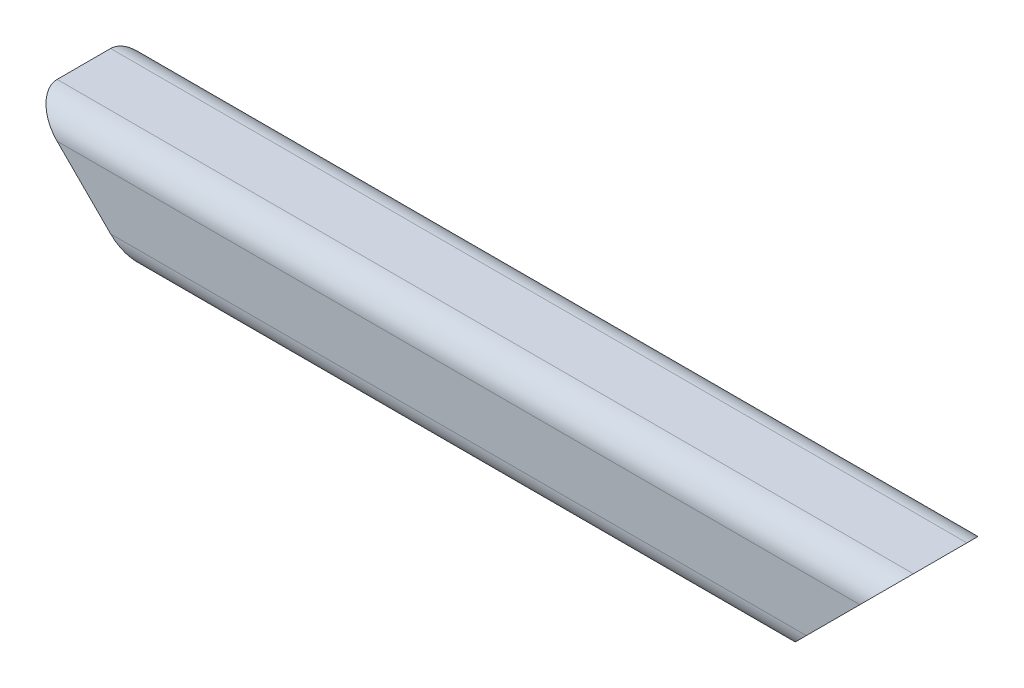
ISO-10303-21;
HEADER;
FILE_DESCRIPTION(('STEP AP214'),'2;1');
FILE_NAME('part.step','',(''),(''),'','','');
FILE_SCHEMA(('AUTOMOTIVE_DESIGN { 1 0 10303 214 1 1 1 1 }'));
ENDSEC;
DATA;
#1=APPLICATION_CONTEXT('core data for automotive mechanical design processes');
#2=APPLICATION_PROTOCOL_DEFINITION('international standard','automotive_design',2000,#1);
#3=PRODUCT_CONTEXT('',#1,'mechanical');
#4=PRODUCT('Part','Part','',(#3));
#5=PRODUCT_RELATED_PRODUCT_CATEGORY('part','',(#4));
#6=PRODUCT_DEFINITION_FORMATION('','',#4);
#7=PRODUCT_DEFINITION_CONTEXT('part definition',#1,'design');
#8=PRODUCT_DEFINITION('design','',#6,#7);
#9=PRODUCT_DEFINITION_SHAPE('','',#8);
#10=(LENGTH_UNIT() NAMED_UNIT(*) SI_UNIT(.MILLI.,.METRE.));
#11=(NAMED_UNIT(*) PLANE_ANGLE_UNIT() SI_UNIT($,.RADIAN.));
#12=(NAMED_UNIT(*) SI_UNIT($,.STERADIAN.) SOLID_ANGLE_UNIT());
#13=UNCERTAINTY_MEASURE_WITH_UNIT(LENGTH_MEASURE(1.E-05),#10,'distance_accuracy_value','');
#14=(GEOMETRIC_REPRESENTATION_CONTEXT(3) GLOBAL_UNCERTAINTY_ASSIGNED_CONTEXT((#13)) GLOBAL_UNIT_ASSIGNED_CONTEXT((#10,
#11,#12)) REPRESENTATION_CONTEXT('',''));
#15=CARTESIAN_POINT('',(0.,0.,0.));
#16=DIRECTION('',(0.,0.,1.));
#17=DIRECTION('',(1.,0.,0.));
#18=AXIS2_PLACEMENT_3D('',#15,#16,#17);
#19=CARTESIAN_POINT('',(-406.4,12.7,12.7));
#20=DIRECTION('',(1.,0.,0.));
#21=DIRECTION('',(0.,0.,-1.));
#22=AXIS2_PLACEMENT_3D('',#19,#20,#21);
#23=CYLINDRICAL_SURFACE('',#22,12.7);
#24=DIRECTION('',(1.,0.,0.));
#25=VECTOR('',#24,1.);
#26=CARTESIAN_POINT('',(-406.4,12.7,25.4));
#27=LINE('',#26,#25);
#28=CARTESIAN_POINT('',(-393.7,12.7,25.4));
#29=VERTEX_POINT('',#28);
#30=CARTESIAN_POINT('',(-12.7,12.7,25.4));
#31=VERTEX_POINT('',#30);
#32=EDGE_CURVE('E193',#29,#31,#27,.T.);
#33=ORIENTED_EDGE('',*,*,#32,.T.);
#34=CARTESIAN_POINT('',(-12.7,12.7,12.7));
#35=DIRECTION('',(-0.707106781186548,0.707106781186548,0.));
#36=DIRECTION('',(0.707106781186548,0.707106781186548,0.));
#37=AXIS2_PLACEMENT_3D('',#34,#35,#36);
#38=ELLIPSE('',#37,17.9605122421383,12.7);
#39=CARTESIAN_POINT('',(0.,25.4,12.7));
#40=VERTEX_POINT('',#39);
#41=EDGE_CURVE('E175',#31,#40,#38,.T.);
#42=ORIENTED_EDGE('',*,*,#41,.T.);
#43=DIRECTION('',(1.,0.,0.));
#44=VECTOR('',#43,1.);
#45=CARTESIAN_POINT('',(-406.4,25.4,12.7));
#46=LINE('',#45,#44);
#47=CARTESIAN_POINT('',(-406.4,25.4,12.7));
#48=VERTEX_POINT('',#47);
#49=EDGE_CURVE('E12',#48,#40,#46,.T.);
#50=ORIENTED_EDGE('',*,*,#49,.F.);
#51=CARTESIAN_POINT('',(-393.7,12.7,12.7));
#52=DIRECTION('',(0.707106781186547,0.707106781186548,0.));
#53=DIRECTION('',(0.707106781186548,-0.707106781186547,0.));
#54=AXIS2_PLACEMENT_3D('',#51,#52,#53);
#55=ELLIPSE('',#54,17.9605122421383,12.7);
#56=EDGE_CURVE('E199',#48,#29,#55,.T.);
#57=ORIENTED_EDGE('',*,*,#56,.T.);
#58=EDGE_LOOP('',(#33,#42,#50,#57));
#59=FACE_BOUND('',#58,.T.);
#60=ADVANCED_FACE('F61',(#59),#23,.T.);
#61=CARTESIAN_POINT('',(-406.4,25.4,12.7));
#62=DIRECTION('',(0.,-1.,0.));
#63=DIRECTION('',(0.,0.,-1.));
#64=AXIS2_PLACEMENT_3D('',#61,#62,#63);
#65=PLANE('',#64);
#66=DIRECTION('',(0.,0.,-1.));
#67=VECTOR('',#66,1.);
#68=CARTESIAN_POINT('',(0.,25.4,12.7));
#69=LINE('',#68,#67);
#70=CARTESIAN_POINT('',(0.,25.4,-12.7));
#71=VERTEX_POINT('',#70);
#72=EDGE_CURVE('E181',#40,#71,#69,.T.);
#73=ORIENTED_EDGE('',*,*,#72,.T.);
#74=DIRECTION('',(1.,0.,0.));
#75=VECTOR('',#74,1.);
#76=CARTESIAN_POINT('',(-406.4,25.4,-12.7));
#77=LINE('',#76,#75);
#78=CARTESIAN_POINT('',(-406.4,25.4,-12.7));
#79=VERTEX_POINT('',#78);
#80=EDGE_CURVE('E70',#79,#71,#77,.T.);
#81=ORIENTED_EDGE('',*,*,#80,.F.);
#82=DIRECTION('',(0.,0.,-1.));
#83=VECTOR('',#82,1.);
#84=CARTESIAN_POINT('',(-406.4,25.4,12.7));
#85=LINE('',#84,#83);
#86=EDGE_CURVE('E225',#48,#79,#85,.T.);
#87=ORIENTED_EDGE('',*,*,#86,.F.);
#88=ORIENTED_EDGE('',*,*,#49,.T.);
#89=EDGE_LOOP('',(#73,#81,#87,#88));
#90=FACE_BOUND('',#89,.T.);
#91=ADVANCED_FACE('F300',(#90),#65,.F.);
#92=CARTESIAN_POINT('',(-406.4,12.7,-12.7));
#93=DIRECTION('',(1.,0.,0.));
#94=DIRECTION('',(0.,0.,-1.));
#95=AXIS2_PLACEMENT_3D('',#92,#93,#94);
#96=CYLINDRICAL_SURFACE('',#95,12.7);
#97=ORIENTED_EDGE('',*,*,#80,.T.);
#98=CARTESIAN_POINT('',(-12.7,12.7,-12.7));
#99=DIRECTION('',(-0.707106781186548,0.707106781186548,0.));
#100=DIRECTION('',(0.707106781186548,0.707106781186548,0.));
#101=AXIS2_PLACEMENT_3D('',#98,#99,#100);
#102=ELLIPSE('',#101,17.9605122421383,12.7);
#103=CARTESIAN_POINT('',(-12.7,12.7,-25.4));
#104=VERTEX_POINT('',#103);
#105=EDGE_CURVE('E186',#71,#104,#102,.T.);
#106=ORIENTED_EDGE('',*,*,#105,.T.);
#107=DIRECTION('',(1.,0.,0.));
#108=VECTOR('',#107,1.);
#109=CARTESIAN_POINT('',(-406.4,12.7,-25.4));
#110=LINE('',#109,#108);
#111=CARTESIAN_POINT('',(-393.7,12.7,-25.4));
#112=VERTEX_POINT('',#111);
#113=EDGE_CURVE('E216',#112,#104,#110,.T.);
#114=ORIENTED_EDGE('',*,*,#113,.F.);
#115=CARTESIAN_POINT('',(-393.7,12.7,-12.7));
#116=DIRECTION('',(0.707106781186547,0.707106781186548,0.));
#117=DIRECTION('',(0.707106781186548,-0.707106781186547,0.));
#118=AXIS2_PLACEMENT_3D('',#115,#116,#117);
#119=ELLIPSE('',#118,17.9605122421383,12.7);
#120=EDGE_CURVE('E293',#112,#79,#119,.T.);
#121=ORIENTED_EDGE('',*,*,#120,.T.);
#122=EDGE_LOOP('',(#97,#106,#114,#121));
#123=FACE_BOUND('',#122,.T.);
#124=ADVANCED_FACE('F302',(#123),#96,.T.);
#125=CARTESIAN_POINT('',(-406.4,-12.7,-25.4));
#126=DIRECTION('',(0.,0.,1.));
#127=DIRECTION('',(1.,0.,0.));
#128=AXIS2_PLACEMENT_3D('',#125,#126,#127);
#129=PLANE('',#128);
#130=ORIENTED_EDGE('',*,*,#113,.T.);
#131=DIRECTION('',(-0.707106781186547,-0.707106781186547,0.));
#132=VECTOR('',#131,1.);
#133=CARTESIAN_POINT('',(0.,25.4,-25.4));
#134=LINE('',#133,#132);
#135=CARTESIAN_POINT('',(-38.1,-12.7,-25.4));
#136=VERTEX_POINT('',#135);
#137=EDGE_CURVE('E196',#104,#136,#134,.T.);
#138=ORIENTED_EDGE('',*,*,#137,.T.);
#139=DIRECTION('',(1.,0.,0.));
#140=VECTOR('',#139,1.);
#141=CARTESIAN_POINT('',(-406.4,-12.7,-25.4));
#142=LINE('',#141,#140);
#143=CARTESIAN_POINT('',(-368.3,-12.7,-25.4));
#144=VERTEX_POINT('',#143);
#145=EDGE_CURVE('E213',#144,#136,#142,.T.);
#146=ORIENTED_EDGE('',*,*,#145,.F.);
#147=DIRECTION('',(-0.707106781186548,0.707106781186547,0.));
#148=VECTOR('',#147,1.);
#149=CARTESIAN_POINT('',(-406.4,25.4,-25.4));
#150=LINE('',#149,#148);
#151=EDGE_CURVE('E268',#144,#112,#150,.T.);
#152=ORIENTED_EDGE('',*,*,#151,.T.);
#153=EDGE_LOOP('',(#130,#138,#146,#152));
#154=FACE_BOUND('',#153,.T.);
#155=ADVANCED_FACE('F307',(#154),#129,.F.);
#156=CARTESIAN_POINT('',(-406.4,-12.7,-12.7));
#157=DIRECTION('',(1.,0.,0.));
#158=DIRECTION('',(0.,0.,-1.));
#159=AXIS2_PLACEMENT_3D('',#156,#157,#158);
#160=CYLINDRICAL_SURFACE('',#159,12.7);
#161=ORIENTED_EDGE('',*,*,#145,.T.);
#162=CARTESIAN_POINT('',(-38.1,-12.7,-12.7));
#163=DIRECTION('',(-0.707106781186548,0.707106781186548,0.));
#164=DIRECTION('',(0.707106781186548,0.707106781186548,0.));
#165=AXIS2_PLACEMENT_3D('',#162,#163,#164);
#166=ELLIPSE('',#165,17.9605122421383,12.7);
#167=CARTESIAN_POINT('',(-50.8,-25.4,-12.7));
#168=VERTEX_POINT('',#167);
#169=EDGE_CURVE('E263',#136,#168,#166,.T.);
#170=ORIENTED_EDGE('',*,*,#169,.T.);
#171=DIRECTION('',(1.,0.,0.));
#172=VECTOR('',#171,1.);
#173=CARTESIAN_POINT('',(-406.4,-25.4,-12.7));
#174=LINE('',#173,#172);
#175=CARTESIAN_POINT('',(-355.6,-25.4,-12.7));
#176=VERTEX_POINT('',#175);
#177=EDGE_CURVE('E210',#176,#168,#174,.T.);
#178=ORIENTED_EDGE('',*,*,#177,.F.);
#179=CARTESIAN_POINT('',(-368.3,-12.7,-12.7));
#180=DIRECTION('',(0.707106781186547,0.707106781186548,0.));
#181=DIRECTION('',(0.707106781186548,-0.707106781186547,0.));
#182=AXIS2_PLACEMENT_3D('',#179,#180,#181);
#183=ELLIPSE('',#182,17.9605122421383,12.7);
#184=EDGE_CURVE('E290',#176,#144,#183,.T.);
#185=ORIENTED_EDGE('',*,*,#184,.T.);
#186=EDGE_LOOP('',(#161,#170,#178,#185));
#187=FACE_BOUND('',#186,.T.);
#188=ADVANCED_FACE('F310',(#187),#160,.T.);
#189=CARTESIAN_POINT('',(-406.4,-25.4,-12.7));
#190=DIRECTION('',(0.,1.,0.));
#191=DIRECTION('',(0.,0.,1.));
#192=AXIS2_PLACEMENT_3D('',#189,#190,#191);
#193=PLANE('',#192);
#194=ORIENTED_EDGE('',*,*,#177,.T.);
#195=DIRECTION('',(0.,0.,1.));
#196=VECTOR('',#195,1.);
#197=CARTESIAN_POINT('',(-50.8,-25.4,-25.4));
#198=LINE('',#197,#196);
#199=CARTESIAN_POINT('',(-50.8,-25.4,12.7));
#200=VERTEX_POINT('',#199);
#201=EDGE_CURVE('E317',#168,#200,#198,.T.);
#202=ORIENTED_EDGE('',*,*,#201,.T.);
#203=DIRECTION('',(1.,0.,0.));
#204=VECTOR('',#203,1.);
#205=CARTESIAN_POINT('',(-406.4,-25.4,12.7));
#206=LINE('',#205,#204);
#207=CARTESIAN_POINT('',(-355.6,-25.4,12.7));
#208=VERTEX_POINT('',#207);
#209=EDGE_CURVE('E201',#208,#200,#206,.T.);
#210=ORIENTED_EDGE('',*,*,#209,.F.);
#211=DIRECTION('',(0.,0.,1.));
#212=VECTOR('',#211,1.);
#213=CARTESIAN_POINT('',(-355.6,-25.4,-25.4));
#214=LINE('',#213,#212);
#215=EDGE_CURVE('E271',#176,#208,#214,.T.);
#216=ORIENTED_EDGE('',*,*,#215,.F.);
#217=EDGE_LOOP('',(#194,#202,#210,#216));
#218=FACE_BOUND('',#217,.T.);
#219=ADVANCED_FACE('F315',(#218),#193,.F.);
#220=CARTESIAN_POINT('',(-406.4,-12.7,12.7));
#221=DIRECTION('',(1.,0.,0.));
#222=DIRECTION('',(0.,0.,-1.));
#223=AXIS2_PLACEMENT_3D('',#220,#221,#222);
#224=CYLINDRICAL_SURFACE('',#223,12.7);
#225=ORIENTED_EDGE('',*,*,#209,.T.);
#226=CARTESIAN_POINT('',(-38.1,-12.7,12.7));
#227=DIRECTION('',(-0.707106781186548,0.707106781186548,0.));
#228=DIRECTION('',(0.707106781186548,0.707106781186548,0.));
#229=AXIS2_PLACEMENT_3D('',#226,#227,#228);
#230=ELLIPSE('',#229,17.9605122421383,12.7);
#231=CARTESIAN_POINT('',(-38.1,-12.7,25.4));
#232=VERTEX_POINT('',#231);
#233=EDGE_CURVE('E256',#200,#232,#230,.T.);
#234=ORIENTED_EDGE('',*,*,#233,.T.);
#235=DIRECTION('',(1.,0.,0.));
#236=VECTOR('',#235,1.);
#237=CARTESIAN_POINT('',(-406.4,-12.7,25.4));
#238=LINE('',#237,#236);
#239=CARTESIAN_POINT('',(-368.3,-12.7,25.4));
#240=VERTEX_POINT('',#239);
#241=EDGE_CURVE('E195',#240,#232,#238,.T.);
#242=ORIENTED_EDGE('',*,*,#241,.F.);
#243=CARTESIAN_POINT('',(-368.3,-12.7,12.7));
#244=DIRECTION('',(0.707106781186547,0.707106781186548,0.));
#245=DIRECTION('',(0.707106781186548,-0.707106781186547,0.));
#246=AXIS2_PLACEMENT_3D('',#243,#244,#245);
#247=ELLIPSE('',#246,17.9605122421383,12.7);
#248=EDGE_CURVE('E287',#240,#208,#247,.T.);
#249=ORIENTED_EDGE('',*,*,#248,.T.);
#250=EDGE_LOOP('',(#225,#234,#242,#249));
#251=FACE_BOUND('',#250,.T.);
#252=ADVANCED_FACE('F319',(#251),#224,.T.);
#253=CARTESIAN_POINT('',(-406.4,12.7,-12.7));
#254=DIRECTION('',(1.,0.,0.));
#255=DIRECTION('',(0.,0.,-1.));
#256=AXIS2_PLACEMENT_3D('',#253,#254,#255);
#257=CYLINDRICAL_SURFACE('',#256,9.525);
#258=CARTESIAN_POINT('',(-12.7,12.7,-12.7));
#259=DIRECTION('',(-0.707106781186548,0.707106781186548,0.));
#260=DIRECTION('',(0.707106781186548,0.707106781186548,0.));
#261=AXIS2_PLACEMENT_3D('',#258,#259,#260);
#262=ELLIPSE('',#261,13.4703841816037,9.525);
#263=CARTESIAN_POINT('',(-3.17500000000004,22.225,-12.7));
#264=VERTEX_POINT('',#263);
#265=CARTESIAN_POINT('',(-12.7000000000001,12.7,-22.225));
#266=VERTEX_POINT('',#265);
#267=EDGE_CURVE('E78',#264,#266,#262,.T.);
#268=ORIENTED_EDGE('',*,*,#267,.F.);
#269=DIRECTION('',(1.,0.,0.));
#270=VECTOR('',#269,1.);
#271=CARTESIAN_POINT('',(-406.4,22.225,-12.7));
#272=LINE('',#271,#270);
#273=CARTESIAN_POINT('',(-403.225,22.225,-12.7));
#274=VERTEX_POINT('',#273);
#275=EDGE_CURVE('E65',#274,#264,#272,.T.);
#276=ORIENTED_EDGE('',*,*,#275,.F.);
#277=CARTESIAN_POINT('',(-393.7,12.7,-12.7));
#278=DIRECTION('',(0.707106781186547,0.707106781186548,0.));
#279=DIRECTION('',(0.707106781186548,-0.707106781186547,0.));
#280=AXIS2_PLACEMENT_3D('',#277,#278,#279);
#281=ELLIPSE('',#280,13.4703841816037,9.525);
#282=CARTESIAN_POINT('',(-393.7,12.7,-22.225));
#283=VERTEX_POINT('',#282);
#284=EDGE_CURVE('E285',#283,#274,#281,.T.);
#285=ORIENTED_EDGE('',*,*,#284,.F.);
#286=DIRECTION('',(1.,0.,0.));
#287=VECTOR('',#286,1.);
#288=CARTESIAN_POINT('',(-406.4,12.7,-22.225));
#289=LINE('',#288,#287);
#290=EDGE_CURVE('E221',#283,#266,#289,.T.);
#291=ORIENTED_EDGE('',*,*,#290,.T.);
#292=EDGE_LOOP('',(#268,#276,#285,#291));
#293=FACE_BOUND('',#292,.T.);
#294=ADVANCED_FACE('F63',(#293),#257,.F.);
#295=CARTESIAN_POINT('',(-406.4,22.225,12.7));
#296=DIRECTION('',(0.,-1.,0.));
#297=DIRECTION('',(0.,0.,-1.));
#298=AXIS2_PLACEMENT_3D('',#295,#296,#297);
#299=PLANE('',#298);
#300=DIRECTION('',(0.,0.,-1.));
#301=VECTOR('',#300,1.);
#302=CARTESIAN_POINT('',(-3.17500000000004,22.225,12.7));
#303=LINE('',#302,#301);
#304=CARTESIAN_POINT('',(-3.17500000000004,22.225,12.7));
#305=VERTEX_POINT('',#304);
#306=EDGE_CURVE('E254',#305,#264,#303,.T.);
#307=ORIENTED_EDGE('',*,*,#306,.F.);
#308=DIRECTION('',(1.,0.,0.));
#309=VECTOR('',#308,1.);
#310=CARTESIAN_POINT('',(-406.4,22.225,12.7));
#311=LINE('',#310,#309);
#312=CARTESIAN_POINT('',(-403.225,22.225,12.7));
#313=VERTEX_POINT('',#312);
#314=EDGE_CURVE('E204',#313,#305,#311,.T.);
#315=ORIENTED_EDGE('',*,*,#314,.F.);
#316=DIRECTION('',(0.,0.,1.));
#317=VECTOR('',#316,1.);
#318=CARTESIAN_POINT('',(-403.225,22.225,12.7));
#319=LINE('',#318,#317);
#320=EDGE_CURVE('E252',#274,#313,#319,.T.);
#321=ORIENTED_EDGE('',*,*,#320,.F.);
#322=ORIENTED_EDGE('',*,*,#275,.T.);
#323=EDGE_LOOP('',(#307,#315,#321,#322));
#324=FACE_BOUND('',#323,.T.);
#325=ADVANCED_FACE('F251',(#324),#299,.T.);
#326=CARTESIAN_POINT('',(-406.4,12.7,12.7));
#327=DIRECTION('',(1.,0.,0.));
#328=DIRECTION('',(0.,0.,-1.));
#329=AXIS2_PLACEMENT_3D('',#326,#327,#328);
#330=CYLINDRICAL_SURFACE('',#329,9.525);
#331=CARTESIAN_POINT('',(-12.7,12.7,12.7));
#332=DIRECTION('',(-0.707106781186548,0.707106781186548,0.));
#333=DIRECTION('',(0.707106781186548,0.707106781186548,0.));
#334=AXIS2_PLACEMENT_3D('',#331,#332,#333);
#335=ELLIPSE('',#334,13.4703841816037,9.525);
#336=CARTESIAN_POINT('',(-12.7,12.7,22.225));
#337=VERTEX_POINT('',#336);
#338=EDGE_CURVE('E246',#337,#305,#335,.T.);
#339=ORIENTED_EDGE('',*,*,#338,.F.);
#340=DIRECTION('',(1.,0.,0.));
#341=VECTOR('',#340,1.);
#342=CARTESIAN_POINT('',(-406.4,12.7,22.225));
#343=LINE('',#342,#341);
#344=CARTESIAN_POINT('',(-393.7,12.7,22.225));
#345=VERTEX_POINT('',#344);
#346=EDGE_CURVE('E237',#345,#337,#343,.T.);
#347=ORIENTED_EDGE('',*,*,#346,.F.);
#348=CARTESIAN_POINT('',(-393.7,12.7,12.7));
#349=DIRECTION('',(0.707106781186547,0.707106781186548,0.));
#350=DIRECTION('',(0.707106781186548,-0.707106781186547,0.));
#351=AXIS2_PLACEMENT_3D('',#348,#349,#350);
#352=ELLIPSE('',#351,13.4703841816037,9.525);
#353=EDGE_CURVE('E247',#313,#345,#352,.T.);
#354=ORIENTED_EDGE('',*,*,#353,.F.);
#355=ORIENTED_EDGE('',*,*,#314,.T.);
#356=EDGE_LOOP('',(#339,#347,#354,#355));
#357=FACE_BOUND('',#356,.T.);
#358=ADVANCED_FACE('F244',(#357),#330,.F.);
#359=CARTESIAN_POINT('',(-406.4,12.7,22.225));
#360=DIRECTION('',(0.,0.,-1.));
#361=DIRECTION('',(-1.,0.,0.));
#362=AXIS2_PLACEMENT_3D('',#359,#360,#361);
#363=PLANE('',#362);
#364=DIRECTION('',(0.707106781186548,0.707106781186548,0.));
#365=VECTOR('',#364,1.);
#366=CARTESIAN_POINT('',(-209.55,-184.15,22.225));
#367=LINE('',#366,#365);
#368=CARTESIAN_POINT('',(-38.1,-12.7,22.225));
#369=VERTEX_POINT('',#368);
#370=EDGE_CURVE('E258',#369,#337,#367,.T.);
#371=ORIENTED_EDGE('',*,*,#370,.F.);
#372=DIRECTION('',(1.,0.,0.));
#373=VECTOR('',#372,1.);
#374=CARTESIAN_POINT('',(-406.4,-12.7,22.225));
#375=LINE('',#374,#373);
#376=CARTESIAN_POINT('',(-368.3,-12.7,22.225));
#377=VERTEX_POINT('',#376);
#378=EDGE_CURVE('E234',#377,#369,#375,.T.);
#379=ORIENTED_EDGE('',*,*,#378,.F.);
#380=DIRECTION('',(0.707106781186548,-0.707106781186547,0.));
#381=VECTOR('',#380,1.);
#382=CARTESIAN_POINT('',(-400.05,19.05,22.225));
#383=LINE('',#382,#381);
#384=EDGE_CURVE('E281',#345,#377,#383,.T.);
#385=ORIENTED_EDGE('',*,*,#384,.F.);
#386=ORIENTED_EDGE('',*,*,#346,.T.);
#387=EDGE_LOOP('',(#371,#379,#385,#386));
#388=FACE_BOUND('',#387,.T.);
#389=ADVANCED_FACE('F334',(#388),#363,.T.);
#390=CARTESIAN_POINT('',(-406.4,-12.7,12.7));
#391=DIRECTION('',(1.,0.,0.));
#392=DIRECTION('',(0.,0.,-1.));
#393=AXIS2_PLACEMENT_3D('',#390,#391,#392);
#394=CYLINDRICAL_SURFACE('',#393,9.525);
#395=CARTESIAN_POINT('',(-38.1,-12.7,12.7));
#396=DIRECTION('',(-0.707106781186548,0.707106781186548,0.));
#397=DIRECTION('',(0.707106781186548,0.707106781186548,0.));
#398=AXIS2_PLACEMENT_3D('',#395,#396,#397);
#399=ELLIPSE('',#398,13.4703841816037,9.525);
#400=CARTESIAN_POINT('',(-47.625,-22.225,12.7));
#401=VERTEX_POINT('',#400);
#402=EDGE_CURVE('E329',#401,#369,#399,.T.);
#403=ORIENTED_EDGE('',*,*,#402,.F.);
#404=DIRECTION('',(1.,0.,0.));
#405=VECTOR('',#404,1.);
#406=CARTESIAN_POINT('',(-406.4,-22.225,12.7));
#407=LINE('',#406,#405);
#408=CARTESIAN_POINT('',(-358.775,-22.225,12.7));
#409=VERTEX_POINT('',#408);
#410=EDGE_CURVE('E231',#409,#401,#407,.T.);
#411=ORIENTED_EDGE('',*,*,#410,.F.);
#412=CARTESIAN_POINT('',(-368.3,-12.7,12.7));
#413=DIRECTION('',(0.707106781186547,0.707106781186548,0.));
#414=DIRECTION('',(0.707106781186548,-0.707106781186547,0.));
#415=AXIS2_PLACEMENT_3D('',#412,#413,#414);
#416=ELLIPSE('',#415,13.4703841816037,9.525);
#417=EDGE_CURVE('E279',#377,#409,#416,.T.);
#418=ORIENTED_EDGE('',*,*,#417,.F.);
#419=ORIENTED_EDGE('',*,*,#378,.T.);
#420=EDGE_LOOP('',(#403,#411,#418,#419));
#421=FACE_BOUND('',#420,.T.);
#422=ADVANCED_FACE('F338',(#421),#394,.F.);
#423=CARTESIAN_POINT('',(-406.4,-22.225,-12.7));
#424=DIRECTION('',(0.,1.,0.));
#425=DIRECTION('',(0.,0.,1.));
#426=AXIS2_PLACEMENT_3D('',#423,#424,#425);
#427=PLANE('',#426);
#428=DIRECTION('',(0.,0.,1.));
#429=VECTOR('',#428,1.);
#430=CARTESIAN_POINT('',(-47.625,-22.225,-12.7));
#431=LINE('',#430,#429);
#432=CARTESIAN_POINT('',(-47.625,-22.225,-12.7));
#433=VERTEX_POINT('',#432);
#434=EDGE_CURVE('E327',#433,#401,#431,.T.);
#435=ORIENTED_EDGE('',*,*,#434,.F.);
#436=DIRECTION('',(1.,0.,0.));
#437=VECTOR('',#436,1.);
#438=CARTESIAN_POINT('',(-406.4,-22.225,-12.7));
#439=LINE('',#438,#437);
#440=CARTESIAN_POINT('',(-358.775,-22.225,-12.7));
#441=VERTEX_POINT('',#440);
#442=EDGE_CURVE('E228',#441,#433,#439,.T.);
#443=ORIENTED_EDGE('',*,*,#442,.F.);
#444=DIRECTION('',(0.,0.,-1.));
#445=VECTOR('',#444,1.);
#446=CARTESIAN_POINT('',(-358.775,-22.225,-12.7));
#447=LINE('',#446,#445);
#448=EDGE_CURVE('E277',#409,#441,#447,.T.);
#449=ORIENTED_EDGE('',*,*,#448,.F.);
#450=ORIENTED_EDGE('',*,*,#410,.T.);
#451=EDGE_LOOP('',(#435,#443,#449,#450));
#452=FACE_BOUND('',#451,.T.);
#453=ADVANCED_FACE('F344',(#452),#427,.T.);
#454=CARTESIAN_POINT('',(-406.4,-12.7,-12.7));
#455=DIRECTION('',(1.,0.,0.));
#456=DIRECTION('',(0.,0.,-1.));
#457=AXIS2_PLACEMENT_3D('',#454,#455,#456);
#458=CYLINDRICAL_SURFACE('',#457,9.525);
#459=CARTESIAN_POINT('',(-38.1,-12.7,-12.7));
#460=DIRECTION('',(-0.707106781186548,0.707106781186548,0.));
#461=DIRECTION('',(0.707106781186548,0.707106781186548,0.));
#462=AXIS2_PLACEMENT_3D('',#459,#460,#461);
#463=ELLIPSE('',#462,13.4703841816037,9.525);
#464=CARTESIAN_POINT('',(-38.1,-12.7,-22.225));
#465=VERTEX_POINT('',#464);
#466=EDGE_CURVE('E322',#465,#433,#463,.T.);
#467=ORIENTED_EDGE('',*,*,#466,.F.);
#468=DIRECTION('',(1.,0.,0.));
#469=VECTOR('',#468,1.);
#470=CARTESIAN_POINT('',(-406.4,-12.7,-22.225));
#471=LINE('',#470,#469);
#472=CARTESIAN_POINT('',(-368.3,-12.7,-22.225));
#473=VERTEX_POINT('',#472);
#474=EDGE_CURVE('E224',#473,#465,#471,.T.);
#475=ORIENTED_EDGE('',*,*,#474,.F.);
#476=CARTESIAN_POINT('',(-368.3,-12.7,-12.7));
#477=DIRECTION('',(0.707106781186547,0.707106781186548,0.));
#478=DIRECTION('',(0.707106781186548,-0.707106781186547,0.));
#479=AXIS2_PLACEMENT_3D('',#476,#477,#478);
#480=ELLIPSE('',#479,13.4703841816037,9.525);
#481=EDGE_CURVE('E86',#441,#473,#480,.T.);
#482=ORIENTED_EDGE('',*,*,#481,.F.);
#483=ORIENTED_EDGE('',*,*,#442,.T.);
#484=EDGE_LOOP('',(#467,#475,#482,#483));
#485=FACE_BOUND('',#484,.T.);
#486=ADVANCED_FACE('F347',(#485),#458,.F.);
#487=CARTESIAN_POINT('',(-406.4,-12.7,-22.225));
#488=DIRECTION('',(0.,0.,1.));
#489=DIRECTION('',(1.,0.,0.));
#490=AXIS2_PLACEMENT_3D('',#487,#488,#489);
#491=PLANE('',#490);
#492=DIRECTION('',(-0.707106781186548,-0.707106781186548,0.));
#493=VECTOR('',#492,1.);
#494=CARTESIAN_POINT('',(-222.25,-196.85,-22.225));
#495=LINE('',#494,#493);
#496=EDGE_CURVE('E320',#266,#465,#495,.T.);
#497=ORIENTED_EDGE('',*,*,#496,.F.);
#498=ORIENTED_EDGE('',*,*,#290,.F.);
#499=DIRECTION('',(-0.707106781186548,0.707106781186547,0.));
#500=VECTOR('',#499,1.);
#501=CARTESIAN_POINT('',(-387.35,6.35000000000001,-22.225));
#502=LINE('',#501,#500);
#503=EDGE_CURVE('E274',#473,#283,#502,.T.);
#504=ORIENTED_EDGE('',*,*,#503,.F.);
#505=ORIENTED_EDGE('',*,*,#474,.T.);
#506=EDGE_LOOP('',(#497,#498,#504,#505));
#507=FACE_BOUND('',#506,.T.);
#508=ADVANCED_FACE('F350',(#507),#491,.T.);
#509=CARTESIAN_POINT('',(-406.4,12.7,25.4));
#510=DIRECTION('',(0.,0.,-1.));
#511=DIRECTION('',(-1.,0.,0.));
#512=AXIS2_PLACEMENT_3D('',#509,#510,#511);
#513=PLANE('',#512);
#514=ORIENTED_EDGE('',*,*,#241,.T.);
#515=DIRECTION('',(-0.707106781186547,-0.707106781186547,0.));
#516=VECTOR('',#515,1.);
#517=CARTESIAN_POINT('',(0.,25.4,25.4));
#518=LINE('',#517,#516);
#519=EDGE_CURVE('E178',#31,#232,#518,.T.);
#520=ORIENTED_EDGE('',*,*,#519,.F.);
#521=ORIENTED_EDGE('',*,*,#32,.F.);
#522=DIRECTION('',(-0.707106781186548,0.707106781186547,0.));
#523=VECTOR('',#522,1.);
#524=CARTESIAN_POINT('',(-406.4,25.4,25.4));
#525=LINE('',#524,#523);
#526=EDGE_CURVE('E185',#240,#29,#525,.T.);
#527=ORIENTED_EDGE('',*,*,#526,.F.);
#528=EDGE_LOOP('',(#514,#520,#521,#527));
#529=FACE_BOUND('',#528,.T.);
#530=ADVANCED_FACE('F191',(#529),#513,.F.);
#531=CARTESIAN_POINT('',(-406.4,25.4,-25.4));
#532=DIRECTION('',(0.707106781186547,0.707106781186548,0.));
#533=DIRECTION('',(-0.707106781186548,0.707106781186547,0.));
#534=AXIS2_PLACEMENT_3D('',#531,#532,#533);
#535=PLANE('',#534);
#536=ORIENTED_EDGE('',*,*,#284,.T.);
#537=ORIENTED_EDGE('',*,*,#320,.T.);
#538=ORIENTED_EDGE('',*,*,#353,.T.);
#539=ORIENTED_EDGE('',*,*,#384,.T.);
#540=ORIENTED_EDGE('',*,*,#417,.T.);
#541=ORIENTED_EDGE('',*,*,#448,.T.);
#542=ORIENTED_EDGE('',*,*,#481,.T.);
#543=ORIENTED_EDGE('',*,*,#503,.T.);
#544=EDGE_LOOP('',(#536,#537,#538,#539,#540,#541,#542,#543));
#545=FACE_BOUND('',#544,.T.);
#546=ORIENTED_EDGE('',*,*,#86,.T.);
#547=ORIENTED_EDGE('',*,*,#120,.F.);
#548=ORIENTED_EDGE('',*,*,#151,.F.);
#549=ORIENTED_EDGE('',*,*,#184,.F.);
#550=ORIENTED_EDGE('',*,*,#215,.T.);
#551=ORIENTED_EDGE('',*,*,#248,.F.);
#552=ORIENTED_EDGE('',*,*,#526,.T.);
#553=ORIENTED_EDGE('',*,*,#56,.F.);
#554=EDGE_LOOP('',(#546,#547,#548,#549,#550,#551,#552,#553));
#555=FACE_BOUND('',#554,.T.);
#556=ADVANCED_FACE('F304',(#545,#555),#535,.F.);
#557=CARTESIAN_POINT('',(0.,25.4,-25.4));
#558=DIRECTION('',(-0.707106781186548,0.707106781186548,0.));
#559=DIRECTION('',(-0.707106781186548,-0.707106781186548,0.));
#560=AXIS2_PLACEMENT_3D('',#557,#558,#559);
#561=PLANE('',#560);
#562=ORIENTED_EDGE('',*,*,#267,.T.);
#563=ORIENTED_EDGE('',*,*,#496,.T.);
#564=ORIENTED_EDGE('',*,*,#466,.T.);
#565=ORIENTED_EDGE('',*,*,#434,.T.);
#566=ORIENTED_EDGE('',*,*,#402,.T.);
#567=ORIENTED_EDGE('',*,*,#370,.T.);
#568=ORIENTED_EDGE('',*,*,#338,.T.);
#569=ORIENTED_EDGE('',*,*,#306,.T.);
#570=EDGE_LOOP('',(#562,#563,#564,#565,#566,#567,#568,#569));
#571=FACE_BOUND('',#570,.T.);
#572=ORIENTED_EDGE('',*,*,#519,.T.);
#573=ORIENTED_EDGE('',*,*,#233,.F.);
#574=ORIENTED_EDGE('',*,*,#201,.F.);
#575=ORIENTED_EDGE('',*,*,#169,.F.);
#576=ORIENTED_EDGE('',*,*,#137,.F.);
#577=ORIENTED_EDGE('',*,*,#105,.F.);
#578=ORIENTED_EDGE('',*,*,#72,.F.);
#579=ORIENTED_EDGE('',*,*,#41,.F.);
#580=EDGE_LOOP('',(#572,#573,#574,#575,#576,#577,#578,#579));
#581=FACE_BOUND('',#580,.T.);
#582=ADVANCED_FACE('F177',(#571,#581),#561,.F.);
#583=CLOSED_SHELL('',(#60,#91,#124,#155,#188,#219,#252,#294,#325,#358,#389,#422,#453,#486,#508,
#530,#556,#582));
#584=MANIFOLD_SOLID_BREP('B2',#583);
#585=ADVANCED_BREP_SHAPE_REPRESENTATION('',(#18,#584),#14);
#586=SHAPE_DEFINITION_REPRESENTATION(#9,#585);
ENDSEC;
END-ISO-10303-21;
